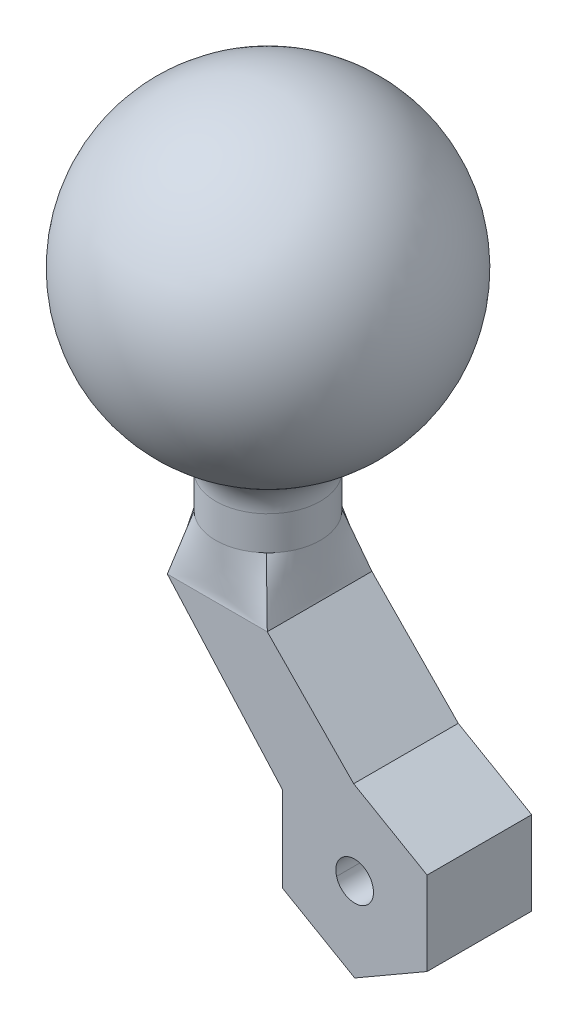
ISO-10303-21;
HEADER;
FILE_DESCRIPTION(('STEP AP214'),'2;1');
FILE_NAME('part.step','',(''),(''),'','','');
FILE_SCHEMA(('AUTOMOTIVE_DESIGN { 1 0 10303 214 1 1 1 1 }'));
ENDSEC;
DATA;
#1=APPLICATION_CONTEXT('core data for automotive mechanical design processes');
#2=APPLICATION_PROTOCOL_DEFINITION('international standard','automotive_design',2000,#1);
#3=PRODUCT_CONTEXT('',#1,'mechanical');
#4=PRODUCT('Part','Part','',(#3));
#5=PRODUCT_RELATED_PRODUCT_CATEGORY('part','',(#4));
#6=PRODUCT_DEFINITION_FORMATION('','',#4);
#7=PRODUCT_DEFINITION_CONTEXT('part definition',#1,'design');
#8=PRODUCT_DEFINITION('design','',#6,#7);
#9=PRODUCT_DEFINITION_SHAPE('','',#8);
#10=(LENGTH_UNIT() NAMED_UNIT(*) SI_UNIT(.MILLI.,.METRE.));
#11=(NAMED_UNIT(*) PLANE_ANGLE_UNIT() SI_UNIT($,.RADIAN.));
#12=(NAMED_UNIT(*) SI_UNIT($,.STERADIAN.) SOLID_ANGLE_UNIT());
#13=UNCERTAINTY_MEASURE_WITH_UNIT(LENGTH_MEASURE(1.E-05),#10,'distance_accuracy_value','');
#14=(GEOMETRIC_REPRESENTATION_CONTEXT(3) GLOBAL_UNCERTAINTY_ASSIGNED_CONTEXT((#13)) GLOBAL_UNIT_ASSIGNED_CONTEXT((#10,
#11,#12)) REPRESENTATION_CONTEXT('',''));
#15=CARTESIAN_POINT('',(0.,0.,0.));
#16=DIRECTION('',(0.,0.,1.));
#17=DIRECTION('',(1.,0.,0.));
#18=AXIS2_PLACEMENT_3D('',#15,#16,#17);
#19=CARTESIAN_POINT('',(0.,0.,0.));
#20=DIRECTION('',(0.,1.,0.));
#21=DIRECTION('',(-1.,0.,0.));
#22=AXIS2_PLACEMENT_3D('',#19,#20,#21);
#23=SPHERICAL_SURFACE('',#22,18.);
#24=CARTESIAN_POINT('',(0.,-15.8079207730885,0.));
#25=DIRECTION('',(0.,1.,0.));
#26=DIRECTION('',(0.,0.,1.));
#27=AXIS2_PLACEMENT_3D('',#24,#25,#26);
#28=CIRCLE('',#27,8.60869565217391);
#29=CARTESIAN_POINT('',(0.,-15.8079207730885,8.60869565217391));
#30=VERTEX_POINT('',#29);
#31=EDGE_CURVE('E466',#30,#30,#28,.T.);
#32=ORIENTED_EDGE('',*,*,#31,.T.);
#33=EDGE_LOOP('',(#32));
#34=FACE_BOUND('',#33,.T.);
#35=ADVANCED_FACE('F75',(#34),#23,.T.);
#36=CARTESIAN_POINT('',(0.,18.,0.));
#37=DIRECTION('',(0.,1.,0.));
#38=DIRECTION('',(0.,0.,1.));
#39=AXIS2_PLACEMENT_3D('',#36,#37,#38);
#40=CYLINDRICAL_SURFACE('',#39,6.);
#41=CARTESIAN_POINT('',(0.,-20.1990098767242,0.));
#42=DIRECTION('',(0.,1.,0.));
#43=DIRECTION('',(0.,0.,1.));
#44=AXIS2_PLACEMENT_3D('',#41,#42,#43);
#45=CIRCLE('',#44,6.);
#46=CARTESIAN_POINT('',(0.,-20.1990098767242,6.));
#47=VERTEX_POINT('',#46);
#48=EDGE_CURVE('E83',#47,#47,#45,.F.);
#49=ORIENTED_EDGE('',*,*,#48,.T.);
#50=EDGE_LOOP('',(#49));
#51=FACE_BOUND('',#50,.T.);
#52=CARTESIAN_POINT('',(4.14571833013754,-24.08,-4.33739778290643));
#53=CARTESIAN_POINT('',(4.40701026801478,-24.08,-4.08765292882736));
#54=CARTESIAN_POINT('',(4.65592378793548,-24.08,-3.80429383977832));
#55=CARTESIAN_POINT('',(5.10675760325183,-24.08,-3.17353189996074));
#56=CARTESIAN_POINT('',(5.30852063268487,-24.08,-2.82608401074052));
#57=CARTESIAN_POINT('',(5.64280491949333,-24.08,-2.07987855028752));
#58=CARTESIAN_POINT('',(5.77514435532255,-24.08,-1.68118045171521));
#59=CARTESIAN_POINT('',(5.95380439136581,-24.08,-0.854911285102975));
#60=CARTESIAN_POINT('',(6.,-24.08,-0.42751017146044));
#61=CARTESIAN_POINT('',(6.,-24.08,0.42751017146044));
#62=CARTESIAN_POINT('',(5.95380439136581,-24.08,0.854911285102975));
#63=CARTESIAN_POINT('',(5.77514435532255,-24.08,1.68118045171521));
#64=CARTESIAN_POINT('',(5.64280491949333,-24.08,2.07987855028752));
#65=CARTESIAN_POINT('',(5.30852063268487,-24.08,2.82608401074052));
#66=CARTESIAN_POINT('',(5.10675760325182,-24.08,3.17353189996074));
#67=CARTESIAN_POINT('',(4.65592378793549,-24.08,3.80429383977832));
#68=CARTESIAN_POINT('',(4.40701026801478,-24.08,4.08765292882735));
#69=CARTESIAN_POINT('',(4.14571833013754,-24.08,4.33739778290643));
#70=B_SPLINE_CURVE_WITH_KNOTS('',3,(#52,#53,#54,#55,#56,#57,#58,#59,#60,#61,#62,#63,#64,#65,#66,
#67,#68,#69),.UNSPECIFIED.,.F.,.F.,(4,2,2,2,2,2,2,2,4),(0.,0.125,0.25,0.375,0.5,0.625,0.75,
0.875,1.),.UNSPECIFIED.);
#71=CARTESIAN_POINT('',(4.14574127214119,-24.08,4.33742170811708));
#72=VERTEX_POINT('',#71);
#73=CARTESIAN_POINT('',(4.1457314055669,-24.08,-4.33741142811178));
#74=VERTEX_POINT('',#73);
#75=EDGE_CURVE('E412',#72,#74,#70,.F.);
#76=ORIENTED_EDGE('',*,*,#75,.T.);
#77=CARTESIAN_POINT('',(0.,-24.08,0.));
#78=DIRECTION('',(0.,1.,0.));
#79=DIRECTION('',(0.,0.,1.));
#80=AXIS2_PLACEMENT_3D('',#77,#78,#79);
#81=CIRCLE('',#80,6.);
#82=CARTESIAN_POINT('',(-4.14574127213373,-24.08,-4.33742170810931));
#83=VERTEX_POINT('',#82);
#84=EDGE_CURVE('E339',#74,#83,#81,.T.);
#85=ORIENTED_EDGE('',*,*,#84,.T.);
#86=CARTESIAN_POINT('',(-4.14573140556426,-24.08,4.33741142810902));
#87=VERTEX_POINT('',#86);
#88=EDGE_CURVE('E97',#83,#87,#81,.T.);
#89=ORIENTED_EDGE('',*,*,#88,.T.);
#90=EDGE_CURVE('E274',#87,#72,#81,.T.);
#91=ORIENTED_EDGE('',*,*,#90,.T.);
#92=EDGE_LOOP('',(#76,#85,#89,#91));
#93=FACE_BOUND('',#92,.T.);
#94=ADVANCED_FACE('F251',(#51,#93),#40,.T.);
#95=CARTESIAN_POINT('',(-5.55391904442774,-30.2,6.));
#96=CARTESIAN_POINT('',(-4.14571833013754,-24.08,4.33739778290643));
#97=CARTESIAN_POINT('',(-4.59811131416244,-30.2,6.));
#98=CARTESIAN_POINT('',(-3.6462286219794,-24.08,4.81481390715194));
#99=CARTESIAN_POINT('',(-3.64230358389714,-30.2,6.));
#100=CARTESIAN_POINT('',(-3.0247003274216,-24.08,5.23886904541464));
#101=CARTESIAN_POINT('',(-2.20859198849919,-30.2,6.));
#102=CARTESIAN_POINT('',(-1.95749985474671,-24.08,5.68478975469574));
#103=CARTESIAN_POINT('',(-1.73068812336654,-30.2,6.));
#104=CARTESIAN_POINT('',(-1.58029554790363,-24.08,5.80175097549326));
#105=CARTESIAN_POINT('',(-0.774880393101239,-30.2,6.));
#106=CARTESIAN_POINT('',(-0.802002169216812,-24.08,5.95939937585429));
#107=CARTESIAN_POINT('',(-0.296976527968589,-30.2,6.));
#108=CARTESIAN_POINT('',(-0.401040805162086,-24.08,6.));
#109=CARTESIAN_POINT('',(0.658831202296711,-30.2,6.));
#110=CARTESIAN_POINT('',(0.401040805162083,-24.08,6.));
#111=CARTESIAN_POINT('',(1.13673506742936,-30.2,6.));
#112=CARTESIAN_POINT('',(0.802002169216809,-24.08,5.95939937585429));
#113=CARTESIAN_POINT('',(2.09254279769466,-30.2,6.));
#114=CARTESIAN_POINT('',(1.58029554790363,-24.08,5.80175097549326));
#115=CARTESIAN_POINT('',(2.57044666282731,-30.2,6.));
#116=CARTESIAN_POINT('',(1.9574998547467,-24.08,5.68478975469574));
#117=CARTESIAN_POINT('',(4.00415825822526,-30.2,6.));
#118=CARTESIAN_POINT('',(3.0247003274216,-24.08,5.23886904541465));
#119=CARTESIAN_POINT('',(4.95996598849056,-30.2,6.));
#120=CARTESIAN_POINT('',(3.6462286219794,-24.08,4.81481390715194));
#121=CARTESIAN_POINT('',(5.91577371875587,-30.2,6.));
#122=CARTESIAN_POINT('',(4.14571833013754,-24.08,4.33739778290643));
#123=B_SPLINE_SURFACE_WITH_KNOTS('',3,1,((#95,#96),(#97,#98),(#99,#100),(#101,#102),(#103,#104),
(#105,#106),(#107,#108),(#109,#110),(#111,#112),(#113,#114),(#115,#116),(#117,#118),(#119,#120),
(#121,#122)),.UNSPECIFIED.,.F.,.F.,.F.,(4,2,2,2,2,2,4),(2,2),(0.,0.25,0.375,0.5,0.625,0.75,1.),
(0.,1.),.UNSPECIFIED.);
#124=DIRECTION('',(-1.,0.,0.));
#125=VECTOR('',#124,1.);
#126=CARTESIAN_POINT('',(-5.55391904442774,-30.2,6.));
#127=LINE('',#126,#125);
#128=CARTESIAN_POINT('',(5.91577371875587,-30.2,6.));
#129=VERTEX_POINT('',#128);
#130=CARTESIAN_POINT('',(-5.55391904442774,-30.2,6.));
#131=VERTEX_POINT('',#130);
#132=EDGE_CURVE('E336',#129,#131,#127,.T.);
#133=DIRECTION('',(-0.268833619175831,0.929497325301414,-0.252513776769391));
#134=VECTOR('',#133,1.);
#135=CARTESIAN_POINT('',(5.0307460244467,-27.14,5.16869889145321));
#136=LINE('',#135,#134);
#137=EDGE_CURVE('E309',#129,#72,#136,.T.);
#138=DIRECTION('',(-0.216770267725418,-0.942077379323195,0.255931362669354));
#139=VECTOR('',#138,1.);
#140=CARTESIAN_POINT('',(-4.84981868728264,-27.14,5.16869889145321));
#141=LINE('',#140,#139);
#142=EDGE_CURVE('E316',#87,#131,#141,.T.);
#143=ORIENTED_EDGE('',*,*,#132,.F.);
#144=ORIENTED_EDGE('',*,*,#137,.T.);
#145=ORIENTED_EDGE('',*,*,#90,.F.);
#146=ORIENTED_EDGE('',*,*,#142,.T.);
#147=EDGE_LOOP('',(#143,#144,#145,#146));
#148=FACE_BOUND('',#147,.T.);
#149=ADVANCED_FACE('F279',(#148),#123,.T.);
#150=CARTESIAN_POINT('',(5.91577371875587,-30.2,6.));
#151=CARTESIAN_POINT('',(4.14571833013754,-24.08,4.33739778290643));
#152=CARTESIAN_POINT('',(5.91577371875587,-30.2,5.5));
#153=CARTESIAN_POINT('',(4.40701026801478,-24.08,4.08765292882735));
#154=CARTESIAN_POINT('',(5.91577371875587,-30.2,5.));
#155=CARTESIAN_POINT('',(4.65592378793549,-24.08,3.80429383977832));
#156=CARTESIAN_POINT('',(5.91577371875587,-30.2,4.));
#157=CARTESIAN_POINT('',(5.10675760325182,-24.08,3.17353189996074));
#158=CARTESIAN_POINT('',(5.91577371875587,-30.2,3.5));
#159=CARTESIAN_POINT('',(5.30852063268487,-24.08,2.82608401074052));
#160=CARTESIAN_POINT('',(5.91577371875587,-30.2,2.5));
#161=CARTESIAN_POINT('',(5.64280491949333,-24.08,2.07987855028752));
#162=CARTESIAN_POINT('',(5.91577371875587,-30.2,2.));
#163=CARTESIAN_POINT('',(5.77514435532255,-24.08,1.68118045171521));
#164=CARTESIAN_POINT('',(5.91577371875587,-30.2,0.999999999999999));
#165=CARTESIAN_POINT('',(5.95380439136581,-24.08,0.854911285102975));
#166=CARTESIAN_POINT('',(5.91577371875587,-30.2,0.499999999999999));
#167=CARTESIAN_POINT('',(6.,-24.08,0.42751017146044));
#168=CARTESIAN_POINT('',(5.91577371875587,-30.2,-0.500000000000001));
#169=CARTESIAN_POINT('',(6.,-24.08,-0.42751017146044));
#170=CARTESIAN_POINT('',(5.91577371875587,-30.2,-1.));
#171=CARTESIAN_POINT('',(5.95380439136581,-24.08,-0.854911285102975));
#172=CARTESIAN_POINT('',(5.91577371875587,-30.2,-2.));
#173=CARTESIAN_POINT('',(5.77514435532255,-24.08,-1.68118045171521));
#174=CARTESIAN_POINT('',(5.91577371875587,-30.2,-2.5));
#175=CARTESIAN_POINT('',(5.64280491949333,-24.08,-2.07987855028752));
#176=CARTESIAN_POINT('',(5.91577371875587,-30.2,-3.5));
#177=CARTESIAN_POINT('',(5.30852063268487,-24.08,-2.82608401074052));
#178=CARTESIAN_POINT('',(5.91577371875587,-30.2,-4.));
#179=CARTESIAN_POINT('',(5.10675760325183,-24.08,-3.17353189996074));
#180=CARTESIAN_POINT('',(5.91577371875587,-30.2,-5.));
#181=CARTESIAN_POINT('',(4.65592378793548,-24.08,-3.80429383977832));
#182=CARTESIAN_POINT('',(5.91577371875587,-30.2,-5.5));
#183=CARTESIAN_POINT('',(4.40701026801478,-24.08,-4.08765292882736));
#184=CARTESIAN_POINT('',(5.91577371875587,-30.2,-6.));
#185=CARTESIAN_POINT('',(4.14571833013754,-24.08,-4.33739778290643));
#186=B_SPLINE_SURFACE_WITH_KNOTS('',3,1,((#150,#151),(#152,#153),(#154,#155),(#156,#157),(#158,
#159),(#160,#161),(#162,#163),(#164,#165),(#166,#167),(#168,#169),(#170,#171),(#172,#173),(#174,
#175),(#176,#177),(#178,#179),(#180,#181),(#182,#183),(#184,#185)),.UNSPECIFIED.,.F.,.F.,.F.,(4,
2,2,2,2,2,2,2,4),(2,2),(0.,0.125,0.25,0.375,0.5,0.625,0.75,0.875,1.),(0.,1.),.UNSPECIFIED.);
#187=DIRECTION('',(0.,0.,1.));
#188=VECTOR('',#187,1.);
#189=CARTESIAN_POINT('',(5.91577371875587,-30.2,-6.));
#190=LINE('',#189,#188);
#191=CARTESIAN_POINT('',(5.91577371875587,-30.2,-6.));
#192=VERTEX_POINT('',#191);
#193=EDGE_CURVE('E323',#192,#129,#190,.T.);
#194=DIRECTION('',(-0.268833619175832,0.929497325301414,0.252513776769391));
#195=VECTOR('',#194,1.);
#196=CARTESIAN_POINT('',(5.0307460244467,-27.14,-5.16869889145321));
#197=LINE('',#196,#195);
#198=EDGE_CURVE('E231',#192,#74,#197,.T.);
#199=ORIENTED_EDGE('',*,*,#193,.F.);
#200=ORIENTED_EDGE('',*,*,#198,.T.);
#201=ORIENTED_EDGE('',*,*,#75,.F.);
#202=ORIENTED_EDGE('',*,*,#137,.F.);
#203=EDGE_LOOP('',(#199,#200,#201,#202));
#204=FACE_BOUND('',#203,.T.);
#205=ADVANCED_FACE('F290',(#204),#186,.T.);
#206=CARTESIAN_POINT('',(-5.55391904442774,-30.2,-6.));
#207=CARTESIAN_POINT('',(-4.14571833013754,-24.08,-4.33739778290643));
#208=CARTESIAN_POINT('',(-5.55391904442774,-30.2,-5.5));
#209=CARTESIAN_POINT('',(-4.40701026801478,-24.08,-4.08765292882736));
#210=CARTESIAN_POINT('',(-5.55391904442774,-30.2,-5.));
#211=CARTESIAN_POINT('',(-4.65592378793548,-24.08,-3.80429383977832));
#212=CARTESIAN_POINT('',(-5.55391904442774,-30.2,-4.));
#213=CARTESIAN_POINT('',(-5.10675760325182,-24.08,-3.17353189996074));
#214=CARTESIAN_POINT('',(-5.55391904442774,-30.2,-3.5));
#215=CARTESIAN_POINT('',(-5.30852063268487,-24.08,-2.82608401074052));
#216=CARTESIAN_POINT('',(-5.55391904442774,-30.2,-2.50000000000001));
#217=CARTESIAN_POINT('',(-5.64280491949333,-24.08,-2.07987855028752));
#218=CARTESIAN_POINT('',(-5.55391904442774,-30.2,-2.00000000000001));
#219=CARTESIAN_POINT('',(-5.77514435532255,-24.08,-1.68118045171521));
#220=CARTESIAN_POINT('',(-5.55391904442774,-30.2,-1.00000000000001));
#221=CARTESIAN_POINT('',(-5.95380439136581,-24.08,-0.854911285102977));
#222=CARTESIAN_POINT('',(-5.55391904442774,-30.2,-0.500000000000007));
#223=CARTESIAN_POINT('',(-6.,-24.08,-0.427510171460441));
#224=CARTESIAN_POINT('',(-5.55391904442774,-30.2,0.499999999999994));
#225=CARTESIAN_POINT('',(-6.,-24.08,0.427510171460439));
#226=CARTESIAN_POINT('',(-5.55391904442774,-30.2,0.999999999999994));
#227=CARTESIAN_POINT('',(-5.95380439136581,-24.08,0.854911285102974));
#228=CARTESIAN_POINT('',(-5.55391904442774,-30.2,1.99999999999999));
#229=CARTESIAN_POINT('',(-5.77514435532255,-24.08,1.68118045171521));
#230=CARTESIAN_POINT('',(-5.55391904442774,-30.2,2.5));
#231=CARTESIAN_POINT('',(-5.64280491949333,-24.08,2.07987855028752));
#232=CARTESIAN_POINT('',(-5.55391904442774,-30.2,3.5));
#233=CARTESIAN_POINT('',(-5.30852063268487,-24.08,2.82608401074052));
#234=CARTESIAN_POINT('',(-5.55391904442774,-30.2,4.));
#235=CARTESIAN_POINT('',(-5.10675760325183,-24.08,3.17353189996074));
#236=CARTESIAN_POINT('',(-5.55391904442774,-30.2,5.));
#237=CARTESIAN_POINT('',(-4.65592378793549,-24.08,3.80429383977832));
#238=CARTESIAN_POINT('',(-5.55391904442774,-30.2,5.5));
#239=CARTESIAN_POINT('',(-4.40701026801478,-24.08,4.08765292882736));
#240=CARTESIAN_POINT('',(-5.55391904442774,-30.2,6.));
#241=CARTESIAN_POINT('',(-4.14571833013754,-24.08,4.33739778290643));
#242=B_SPLINE_SURFACE_WITH_KNOTS('',3,1,((#206,#207),(#208,#209),(#210,#211),(#212,#213),(#214,
#215),(#216,#217),(#218,#219),(#220,#221),(#222,#223),(#224,#225),(#226,#227),(#228,#229),(#230,
#231),(#232,#233),(#234,#235),(#236,#237),(#238,#239),(#240,#241)),.UNSPECIFIED.,.F.,.F.,.F.,(4,
2,2,2,2,2,2,2,4),(2,2),(0.,0.125,0.25,0.375,0.5,0.625,0.75,0.875,1.),(0.,1.),.UNSPECIFIED.);
#243=DIRECTION('',(0.,0.,1.));
#244=VECTOR('',#243,1.);
#245=CARTESIAN_POINT('',(-5.55391904442774,-30.2,-6.));
#246=LINE('',#245,#244);
#247=CARTESIAN_POINT('',(-5.55391904442774,-30.2,-6.));
#248=VERTEX_POINT('',#247);
#249=EDGE_CURVE('E209',#248,#131,#246,.T.);
#250=DIRECTION('',(0.216770267725418,0.942077379323195,0.255931362669353));
#251=VECTOR('',#250,1.);
#252=CARTESIAN_POINT('',(-4.84981868728264,-27.14,-5.16869889145321));
#253=LINE('',#252,#251);
#254=EDGE_CURVE('E340',#248,#83,#253,.T.);
#255=ORIENTED_EDGE('',*,*,#249,.T.);
#256=ORIENTED_EDGE('',*,*,#142,.F.);
#257=ORIENTED_EDGE('',*,*,#88,.F.);
#258=ORIENTED_EDGE('',*,*,#254,.F.);
#259=EDGE_LOOP('',(#255,#256,#257,#258));
#260=FACE_BOUND('',#259,.T.);
#261=ADVANCED_FACE('F246',(#260),#242,.T.);
#262=CARTESIAN_POINT('',(5.91577371875587,-30.2,-6.));
#263=CARTESIAN_POINT('',(4.14571833013754,-24.08,-4.33739778290643));
#264=CARTESIAN_POINT('',(4.95996598849057,-30.2,-6.));
#265=CARTESIAN_POINT('',(3.6462286219794,-24.08,-4.81481390715194));
#266=CARTESIAN_POINT('',(4.00415825822527,-30.2,-6.));
#267=CARTESIAN_POINT('',(3.02470032742161,-24.08,-5.23886904541464));
#268=CARTESIAN_POINT('',(2.57044666282732,-30.2,-6.));
#269=CARTESIAN_POINT('',(1.95749985474671,-24.08,-5.68478975469574));
#270=CARTESIAN_POINT('',(2.09254279769466,-30.2,-6.));
#271=CARTESIAN_POINT('',(1.58029554790363,-24.08,-5.80175097549326));
#272=CARTESIAN_POINT('',(1.13673506742936,-30.2,-6.));
#273=CARTESIAN_POINT('',(0.802002169216811,-24.08,-5.95939937585429));
#274=CARTESIAN_POINT('',(0.658831202296713,-30.2,-6.));
#275=CARTESIAN_POINT('',(0.401040805162085,-24.08,-6.));
#276=CARTESIAN_POINT('',(-0.296976527968588,-30.2,-6.));
#277=CARTESIAN_POINT('',(-0.401040805162082,-24.08,-6.));
#278=CARTESIAN_POINT('',(-0.774880393101237,-30.2,-6.));
#279=CARTESIAN_POINT('',(-0.802002169216809,-24.08,-5.95939937585429));
#280=CARTESIAN_POINT('',(-1.73068812336654,-30.2,-6.));
#281=CARTESIAN_POINT('',(-1.58029554790363,-24.08,-5.80175097549326));
#282=CARTESIAN_POINT('',(-2.20859198849919,-30.2,-6.));
#283=CARTESIAN_POINT('',(-1.9574998547467,-24.08,-5.68478975469574));
#284=CARTESIAN_POINT('',(-3.64230358389714,-30.2,-6.));
#285=CARTESIAN_POINT('',(-3.0247003274216,-24.08,-5.23886904541464));
#286=CARTESIAN_POINT('',(-4.59811131416244,-30.2,-6.));
#287=CARTESIAN_POINT('',(-3.6462286219794,-24.08,-4.81481390715194));
#288=CARTESIAN_POINT('',(-5.55391904442774,-30.2,-6.));
#289=CARTESIAN_POINT('',(-4.14571833013754,-24.08,-4.33739778290643));
#290=B_SPLINE_SURFACE_WITH_KNOTS('',3,1,((#262,#263),(#264,#265),(#266,#267),(#268,#269),(#270,
#271),(#272,#273),(#274,#275),(#276,#277),(#278,#279),(#280,#281),(#282,#283),(#284,#285),(#286,
#287),(#288,#289)),.UNSPECIFIED.,.F.,.F.,.F.,(4,2,2,2,2,2,4),(2,2),(0.,0.25,0.375,0.5,0.625,
0.75,1.),(0.,1.),.UNSPECIFIED.);
#291=DIRECTION('',(-1.,0.,0.));
#292=VECTOR('',#291,1.);
#293=CARTESIAN_POINT('',(-5.55391904442774,-30.2,-6.));
#294=LINE('',#293,#292);
#295=EDGE_CURVE('E225',#192,#248,#294,.T.);
#296=ORIENTED_EDGE('',*,*,#295,.T.);
#297=ORIENTED_EDGE('',*,*,#254,.T.);
#298=ORIENTED_EDGE('',*,*,#84,.F.);
#299=ORIENTED_EDGE('',*,*,#198,.F.);
#300=EDGE_LOOP('',(#296,#297,#298,#299));
#301=FACE_BOUND('',#300,.T.);
#302=ADVANCED_FACE('F233',(#301),#290,.T.);
#303=CARTESIAN_POINT('',(5.91577371875587,-30.2,-6.));
#304=DIRECTION('',(0.715387628117391,0.698727802178053,0.));
#305=DIRECTION('',(-0.698727802178053,0.715387628117392,0.));
#306=AXIS2_PLACEMENT_3D('',#303,#304,#305);
#307=PLANE('',#306);
#308=ORIENTED_EDGE('',*,*,#193,.T.);
#309=DIRECTION('',(-0.698727802178053,0.715387628117391,0.));
#310=VECTOR('',#309,1.);
#311=CARTESIAN_POINT('',(5.91577371875587,-30.2,6.));
#312=LINE('',#311,#310);
#313=CARTESIAN_POINT('',(15.8240162033495,-40.344485546117,6.));
#314=VERTEX_POINT('',#313);
#315=EDGE_CURVE('E181',#314,#129,#312,.T.);
#316=ORIENTED_EDGE('',*,*,#315,.F.);
#317=DIRECTION('',(0.,0.,1.));
#318=VECTOR('',#317,1.);
#319=CARTESIAN_POINT('',(15.8240162033495,-40.344485546117,-6.));
#320=LINE('',#319,#318);
#321=CARTESIAN_POINT('',(15.8240162033495,-40.344485546117,-6.));
#322=VERTEX_POINT('',#321);
#323=EDGE_CURVE('E207',#322,#314,#320,.T.);
#324=ORIENTED_EDGE('',*,*,#323,.F.);
#325=DIRECTION('',(-0.698727802178053,0.715387628117391,0.));
#326=VECTOR('',#325,1.);
#327=CARTESIAN_POINT('',(5.91577371875587,-30.2,-6.));
#328=LINE('',#327,#326);
#329=EDGE_CURVE('E206',#322,#192,#328,.T.);
#330=ORIENTED_EDGE('',*,*,#329,.T.);
#331=EDGE_LOOP('',(#308,#316,#324,#330));
#332=FACE_BOUND('',#331,.T.);
#333=ADVANCED_FACE('F245',(#332),#307,.T.);
#334=CARTESIAN_POINT('',(24.2478578106904,-45.2079927657261,-6.));
#335=DIRECTION('',(0.5,0.866025403784439,0.));
#336=DIRECTION('',(-0.866025403784439,0.5,0.));
#337=AXIS2_PLACEMENT_3D('',#334,#335,#336);
#338=PLANE('',#337);
#339=ORIENTED_EDGE('',*,*,#323,.T.);
#340=DIRECTION('',(-0.866025403784438,0.5,0.));
#341=VECTOR('',#340,1.);
#342=CARTESIAN_POINT('',(24.2478578106904,-45.2079927657261,6.));
#343=LINE('',#342,#341);
#344=CARTESIAN_POINT('',(24.2478578106904,-45.2079927657261,6.));
#345=VERTEX_POINT('',#344);
#346=EDGE_CURVE('E187',#345,#314,#343,.T.);
#347=ORIENTED_EDGE('',*,*,#346,.F.);
#348=DIRECTION('',(0.,0.,1.));
#349=VECTOR('',#348,1.);
#350=CARTESIAN_POINT('',(24.2478578106904,-45.2079927657261,-6.));
#351=LINE('',#350,#349);
#352=CARTESIAN_POINT('',(24.2478578106904,-45.2079927657261,-6.));
#353=VERTEX_POINT('',#352);
#354=EDGE_CURVE('E210',#353,#345,#351,.T.);
#355=ORIENTED_EDGE('',*,*,#354,.F.);
#356=DIRECTION('',(-0.866025403784438,0.5,0.));
#357=VECTOR('',#356,1.);
#358=CARTESIAN_POINT('',(24.2478578106904,-45.2079927657261,-6.));
#359=LINE('',#358,#357);
#360=EDGE_CURVE('E203',#353,#322,#359,.T.);
#361=ORIENTED_EDGE('',*,*,#360,.T.);
#362=EDGE_LOOP('',(#339,#347,#355,#361));
#363=FACE_BOUND('',#362,.T.);
#364=ADVANCED_FACE('F437',(#363),#338,.T.);
#365=CARTESIAN_POINT('',(24.2478578106904,-54.7920072342739,-6.));
#366=DIRECTION('',(1.,0.,0.));
#367=DIRECTION('',(0.,0.,-1.));
#368=AXIS2_PLACEMENT_3D('',#365,#366,#367);
#369=PLANE('',#368);
#370=ORIENTED_EDGE('',*,*,#354,.T.);
#371=DIRECTION('',(0.,1.,0.));
#372=VECTOR('',#371,1.);
#373=CARTESIAN_POINT('',(24.2478578106904,-54.7920072342739,6.));
#374=LINE('',#373,#372);
#375=CARTESIAN_POINT('',(24.2478578106904,-54.7920072342739,6.));
#376=VERTEX_POINT('',#375);
#377=EDGE_CURVE('E431',#376,#345,#374,.T.);
#378=ORIENTED_EDGE('',*,*,#377,.F.);
#379=DIRECTION('',(0.,0.,1.));
#380=VECTOR('',#379,1.);
#381=CARTESIAN_POINT('',(24.2478578106904,-54.7920072342739,-6.));
#382=LINE('',#381,#380);
#383=CARTESIAN_POINT('',(24.2478578106904,-54.7920072342739,-6.));
#384=VERTEX_POINT('',#383);
#385=EDGE_CURVE('E212',#384,#376,#382,.T.);
#386=ORIENTED_EDGE('',*,*,#385,.F.);
#387=DIRECTION('',(0.,1.,0.));
#388=VECTOR('',#387,1.);
#389=CARTESIAN_POINT('',(24.2478578106904,-54.7920072342739,-6.));
#390=LINE('',#389,#388);
#391=EDGE_CURVE('E200',#384,#353,#390,.T.);
#392=ORIENTED_EDGE('',*,*,#391,.T.);
#393=EDGE_LOOP('',(#370,#378,#386,#392));
#394=FACE_BOUND('',#393,.T.);
#395=ADVANCED_FACE('F441',(#394),#369,.T.);
#396=CARTESIAN_POINT('',(15.9478578106904,-59.5840144685478,-6.));
#397=DIRECTION('',(0.5,-0.866025403784439,0.));
#398=DIRECTION('',(0.866025403784439,0.5,0.));
#399=AXIS2_PLACEMENT_3D('',#396,#397,#398);
#400=PLANE('',#399);
#401=ORIENTED_EDGE('',*,*,#385,.T.);
#402=DIRECTION('',(0.866025403784439,0.5,0.));
#403=VECTOR('',#402,1.);
#404=CARTESIAN_POINT('',(15.9478578106904,-59.5840144685478,6.));
#405=LINE('',#404,#403);
#406=CARTESIAN_POINT('',(15.9478578106904,-59.5840144685478,6.));
#407=VERTEX_POINT('',#406);
#408=EDGE_CURVE('E429',#407,#376,#405,.T.);
#409=ORIENTED_EDGE('',*,*,#408,.F.);
#410=DIRECTION('',(0.,0.,1.));
#411=VECTOR('',#410,1.);
#412=CARTESIAN_POINT('',(15.9478578106904,-59.5840144685478,-6.));
#413=LINE('',#412,#411);
#414=CARTESIAN_POINT('',(15.9478578106904,-59.5840144685478,-6.));
#415=VERTEX_POINT('',#414);
#416=EDGE_CURVE('E214',#415,#407,#413,.T.);
#417=ORIENTED_EDGE('',*,*,#416,.F.);
#418=DIRECTION('',(0.866025403784439,0.5,0.));
#419=VECTOR('',#418,1.);
#420=CARTESIAN_POINT('',(15.9478578106904,-59.5840144685478,-6.));
#421=LINE('',#420,#419);
#422=EDGE_CURVE('E197',#415,#384,#421,.T.);
#423=ORIENTED_EDGE('',*,*,#422,.T.);
#424=EDGE_LOOP('',(#401,#409,#417,#423));
#425=FACE_BOUND('',#424,.T.);
#426=ADVANCED_FACE('F444',(#425),#400,.T.);
#427=CARTESIAN_POINT('',(7.64785781069043,-54.7920072342739,-6.));
#428=DIRECTION('',(-0.5,-0.866025403784439,0.));
#429=DIRECTION('',(0.866025403784439,-0.5,0.));
#430=AXIS2_PLACEMENT_3D('',#427,#428,#429);
#431=PLANE('',#430);
#432=ORIENTED_EDGE('',*,*,#416,.T.);
#433=DIRECTION('',(0.866025403784439,-0.5,0.));
#434=VECTOR('',#433,1.);
#435=CARTESIAN_POINT('',(7.64785781069043,-54.7920072342739,6.));
#436=LINE('',#435,#434);
#437=CARTESIAN_POINT('',(7.64785781069043,-54.7920072342739,6.));
#438=VERTEX_POINT('',#437);
#439=EDGE_CURVE('E422',#438,#407,#436,.T.);
#440=ORIENTED_EDGE('',*,*,#439,.F.);
#441=DIRECTION('',(0.,0.,1.));
#442=VECTOR('',#441,1.);
#443=CARTESIAN_POINT('',(7.64785781069043,-54.7920072342739,-6.));
#444=LINE('',#443,#442);
#445=CARTESIAN_POINT('',(7.64785781069043,-54.7920072342739,-6.));
#446=VERTEX_POINT('',#445);
#447=EDGE_CURVE('E216',#446,#438,#444,.T.);
#448=ORIENTED_EDGE('',*,*,#447,.F.);
#449=DIRECTION('',(0.866025403784439,-0.5,0.));
#450=VECTOR('',#449,1.);
#451=CARTESIAN_POINT('',(7.64785781069043,-54.7920072342739,-6.));
#452=LINE('',#451,#450);
#453=EDGE_CURVE('E194',#446,#415,#452,.T.);
#454=ORIENTED_EDGE('',*,*,#453,.T.);
#455=EDGE_LOOP('',(#432,#440,#448,#454));
#456=FACE_BOUND('',#455,.T.);
#457=ADVANCED_FACE('F447',(#456),#431,.T.);
#458=CARTESIAN_POINT('',(7.64785781069043,-45.0163462038361,-6.));
#459=DIRECTION('',(-1.,0.,0.));
#460=DIRECTION('',(0.,0.,1.));
#461=AXIS2_PLACEMENT_3D('',#458,#459,#460);
#462=PLANE('',#461);
#463=ORIENTED_EDGE('',*,*,#447,.T.);
#464=DIRECTION('',(0.,-1.,0.));
#465=VECTOR('',#464,1.);
#466=CARTESIAN_POINT('',(7.64785781069043,-45.0163462038361,6.));
#467=LINE('',#466,#465);
#468=CARTESIAN_POINT('',(7.64785781069043,-45.0163462038361,6.));
#469=VERTEX_POINT('',#468);
#470=EDGE_CURVE('E416',#469,#438,#467,.T.);
#471=ORIENTED_EDGE('',*,*,#470,.F.);
#472=DIRECTION('',(0.,0.,1.));
#473=VECTOR('',#472,1.);
#474=CARTESIAN_POINT('',(7.64785781069043,-45.0163462038361,-6.));
#475=LINE('',#474,#473);
#476=CARTESIAN_POINT('',(7.64785781069043,-45.0163462038361,-6.));
#477=VERTEX_POINT('',#476);
#478=EDGE_CURVE('E218',#477,#469,#475,.T.);
#479=ORIENTED_EDGE('',*,*,#478,.F.);
#480=DIRECTION('',(0.,-1.,0.));
#481=VECTOR('',#480,1.);
#482=CARTESIAN_POINT('',(7.64785781069043,-45.0163462038361,-6.));
#483=LINE('',#482,#481);
#484=EDGE_CURVE('E184',#477,#446,#483,.T.);
#485=ORIENTED_EDGE('',*,*,#484,.T.);
#486=EDGE_LOOP('',(#463,#471,#479,#485));
#487=FACE_BOUND('',#486,.T.);
#488=ADVANCED_FACE('F450',(#487),#462,.T.);
#489=CARTESIAN_POINT('',(7.64785781069043,-45.0163462038361,-6.));
#490=DIRECTION('',(-0.746615808227149,-0.665255465896614,0.));
#491=DIRECTION('',(0.665255465896614,-0.746615808227149,0.));
#492=AXIS2_PLACEMENT_3D('',#489,#490,#491);
#493=PLANE('',#492);
#494=ORIENTED_EDGE('',*,*,#478,.T.);
#495=DIRECTION('',(0.665255465896614,-0.746615808227149,0.));
#496=VECTOR('',#495,1.);
#497=CARTESIAN_POINT('',(7.64785781069043,-45.0163462038361,6.));
#498=LINE('',#497,#496);
#499=EDGE_CURVE('E414',#131,#469,#498,.T.);
#500=ORIENTED_EDGE('',*,*,#499,.F.);
#501=ORIENTED_EDGE('',*,*,#249,.F.);
#502=DIRECTION('',(0.665255465896614,-0.746615808227149,0.));
#503=VECTOR('',#502,1.);
#504=CARTESIAN_POINT('',(7.64785781069043,-45.0163462038361,-6.));
#505=LINE('',#504,#503);
#506=EDGE_CURVE('E180',#248,#477,#505,.T.);
#507=ORIENTED_EDGE('',*,*,#506,.T.);
#508=EDGE_LOOP('',(#494,#500,#501,#507));
#509=FACE_BOUND('',#508,.T.);
#510=ADVANCED_FACE('F291',(#509),#493,.T.);
#511=CARTESIAN_POINT('',(0.,0.,-6.));
#512=DIRECTION('',(0.,0.,1.));
#513=DIRECTION('',(1.,0.,0.));
#514=AXIS2_PLACEMENT_3D('',#511,#512,#513);
#515=PLANE('',#514);
#516=CARTESIAN_POINT('',(15.9478578106904,-50.,-6.));
#517=DIRECTION('',(0.,0.,1.));
#518=DIRECTION('',(1.,0.,0.));
#519=AXIS2_PLACEMENT_3D('',#516,#517,#518);
#520=CIRCLE('',#519,2.15);
#521=CARTESIAN_POINT('',(13.8644344416051,-50.5308927058728,-6.));
#522=VERTEX_POINT('',#521);
#523=CARTESIAN_POINT('',(18.0104749118831,-49.3932787346174,-6.));
#524=VERTEX_POINT('',#523);
#525=EDGE_CURVE('E174',#522,#524,#520,.T.);
#526=ORIENTED_EDGE('',*,*,#525,.T.);
#527=CARTESIAN_POINT('',(15.9270515427977,-49.9241714404901,-6.));
#528=DIRECTION('',(0.,0.,-1.));
#529=DIRECTION('',(-1.,0.,0.));
#530=AXIS2_PLACEMENT_3D('',#527,#528,#529);
#531=CIRCLE('',#530,2.15);
#532=EDGE_CURVE('E163',#522,#524,#531,.T.);
#533=ORIENTED_EDGE('',*,*,#532,.F.);
#534=EDGE_LOOP('',(#526,#533));
#535=FACE_BOUND('',#534,.T.);
#536=ORIENTED_EDGE('',*,*,#295,.F.);
#537=ORIENTED_EDGE('',*,*,#329,.F.);
#538=ORIENTED_EDGE('',*,*,#360,.F.);
#539=ORIENTED_EDGE('',*,*,#391,.F.);
#540=ORIENTED_EDGE('',*,*,#422,.F.);
#541=ORIENTED_EDGE('',*,*,#453,.F.);
#542=ORIENTED_EDGE('',*,*,#484,.F.);
#543=ORIENTED_EDGE('',*,*,#506,.F.);
#544=EDGE_LOOP('',(#536,#537,#538,#539,#540,#541,#542,#543));
#545=FACE_BOUND('',#544,.T.);
#546=ADVANCED_FACE('F178',(#535,#545),#515,.F.);
#547=CARTESIAN_POINT('',(15.9478578106904,-50.,-6.));
#548=DIRECTION('',(0.,0.,1.));
#549=DIRECTION('',(1.,0.,0.));
#550=AXIS2_PLACEMENT_3D('',#547,#548,#549);
#551=CYLINDRICAL_SURFACE('',#550,2.15);
#552=ORIENTED_EDGE('',*,*,#525,.F.);
#553=DIRECTION('',(0.,0.,-1.));
#554=VECTOR('',#553,1.);
#555=CARTESIAN_POINT('',(13.8644344416051,-50.5308927058728,4.));
#556=LINE('',#555,#554);
#557=CARTESIAN_POINT('',(13.8644344416051,-50.5308927058728,6.));
#558=VERTEX_POINT('',#557);
#559=EDGE_CURVE('E166',#522,#558,#556,.F.);
#560=ORIENTED_EDGE('',*,*,#559,.T.);
#561=CARTESIAN_POINT('',(15.9478578106904,-50.,6.));
#562=DIRECTION('',(0.,0.,1.));
#563=DIRECTION('',(1.,0.,0.));
#564=AXIS2_PLACEMENT_3D('',#561,#562,#563);
#565=CIRCLE('',#564,2.15);
#566=CARTESIAN_POINT('',(18.0104749118831,-49.3932787346174,6.));
#567=VERTEX_POINT('',#566);
#568=EDGE_CURVE('E176',#558,#567,#565,.T.);
#569=ORIENTED_EDGE('',*,*,#568,.T.);
#570=DIRECTION('',(0.,0.,-1.));
#571=VECTOR('',#570,1.);
#572=CARTESIAN_POINT('',(18.0104749118831,-49.3932787346174,4.));
#573=LINE('',#572,#571);
#574=EDGE_CURVE('E89',#567,#524,#573,.T.);
#575=ORIENTED_EDGE('',*,*,#574,.T.);
#576=EDGE_LOOP('',(#552,#560,#569,#575));
#577=FACE_BOUND('',#576,.T.);
#578=ADVANCED_FACE('F173',(#577),#551,.F.);
#579=CARTESIAN_POINT('',(0.,0.,6.));
#580=DIRECTION('',(0.,0.,1.));
#581=DIRECTION('',(1.,0.,0.));
#582=AXIS2_PLACEMENT_3D('',#579,#580,#581);
#583=PLANE('',#582);
#584=CARTESIAN_POINT('',(15.9270515427977,-49.9241714404901,6.));
#585=DIRECTION('',(0.,0.,1.));
#586=DIRECTION('',(1.,0.,0.));
#587=AXIS2_PLACEMENT_3D('',#584,#585,#586);
#588=CIRCLE('',#587,2.15);
#589=EDGE_CURVE('E14',#567,#558,#588,.T.);
#590=ORIENTED_EDGE('',*,*,#589,.F.);
#591=ORIENTED_EDGE('',*,*,#568,.F.);
#592=EDGE_LOOP('',(#590,#591));
#593=FACE_BOUND('',#592,.T.);
#594=ORIENTED_EDGE('',*,*,#132,.T.);
#595=ORIENTED_EDGE('',*,*,#499,.T.);
#596=ORIENTED_EDGE('',*,*,#470,.T.);
#597=ORIENTED_EDGE('',*,*,#439,.T.);
#598=ORIENTED_EDGE('',*,*,#408,.T.);
#599=ORIENTED_EDGE('',*,*,#377,.T.);
#600=ORIENTED_EDGE('',*,*,#346,.T.);
#601=ORIENTED_EDGE('',*,*,#315,.T.);
#602=EDGE_LOOP('',(#594,#595,#596,#597,#598,#599,#600,#601));
#603=FACE_BOUND('',#602,.T.);
#604=ADVANCED_FACE('F374',(#593,#603),#583,.T.);
#605=CARTESIAN_POINT('',(0.,-20.1990098767242,0.));
#606=DIRECTION('',(0.,1.,0.));
#607=DIRECTION('',(0.,0.,1.));
#608=AXIS2_PLACEMENT_3D('',#605,#606,#607);
#609=TOROIDAL_SURFACE('',#608,11.,5.);
#610=ORIENTED_EDGE('',*,*,#48,.F.);
#611=EDGE_LOOP('',(#610));
#612=FACE_BOUND('',#611,.T.);
#613=ORIENTED_EDGE('',*,*,#31,.F.);
#614=EDGE_LOOP('',(#613));
#615=FACE_BOUND('',#614,.T.);
#616=ADVANCED_FACE('F77',(#612,#615),#609,.F.);
#617=CARTESIAN_POINT('',(15.9270515427977,-49.9241714404901,14.));
#618=DIRECTION('',(0.,0.,-1.));
#619=DIRECTION('',(-1.,0.,0.));
#620=AXIS2_PLACEMENT_3D('',#617,#618,#619);
#621=CYLINDRICAL_SURFACE('',#620,2.15);
#622=ORIENTED_EDGE('',*,*,#532,.T.);
#623=ORIENTED_EDGE('',*,*,#574,.F.);
#624=ORIENTED_EDGE('',*,*,#589,.T.);
#625=ORIENTED_EDGE('',*,*,#559,.F.);
#626=EDGE_LOOP('',(#622,#623,#624,#625));
#627=FACE_BOUND('',#626,.T.);
#628=ADVANCED_FACE('F164',(#627),#621,.F.);
#629=CLOSED_SHELL('',(#35,#94,#149,#205,#261,#302,#333,#364,#395,#426,#457,#488,#510,#546,#578,
#604,#616,#628));
#630=MANIFOLD_SOLID_BREP('B2',#629);
#631=ADVANCED_BREP_SHAPE_REPRESENTATION('',(#18,#630),#14);
#632=SHAPE_DEFINITION_REPRESENTATION(#9,#631);
ENDSEC;
END-ISO-10303-21;
